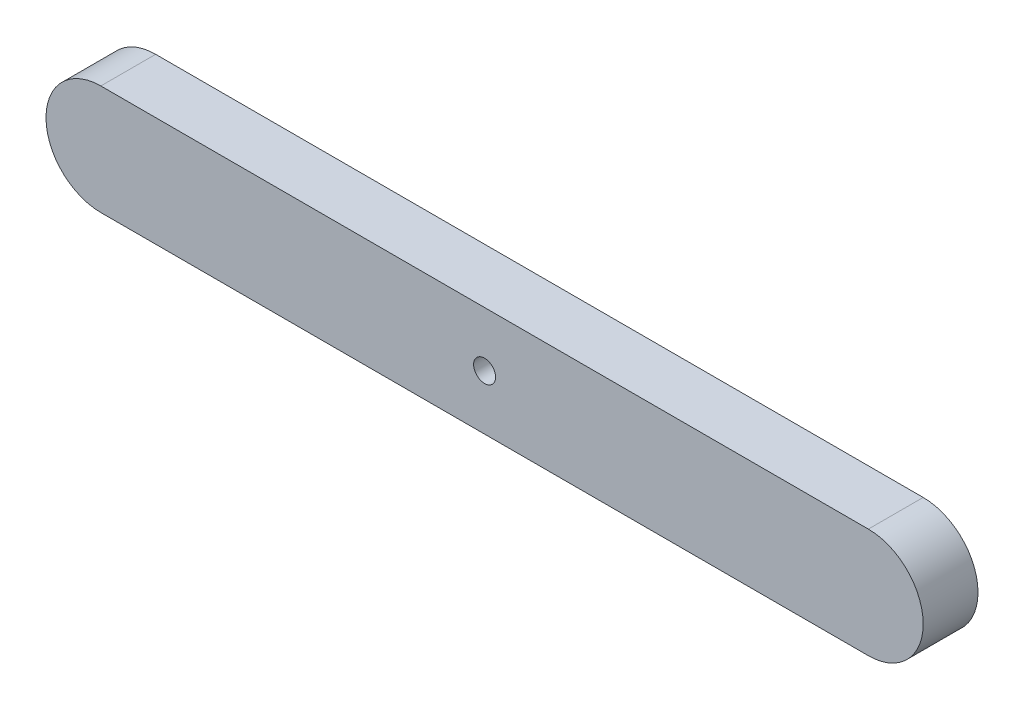
ISO-10303-21;
HEADER;
FILE_DESCRIPTION(('STEP AP214'),'2;1');
FILE_NAME('part.step','',(''),(''),'','','');
FILE_SCHEMA(('AUTOMOTIVE_DESIGN { 1 0 10303 214 1 1 1 1 }'));
ENDSEC;
DATA;
#1=APPLICATION_CONTEXT('core data for automotive mechanical design processes');
#2=APPLICATION_PROTOCOL_DEFINITION('international standard','automotive_design',2000,#1);
#3=PRODUCT_CONTEXT('',#1,'mechanical');
#4=PRODUCT('Part','Part','',(#3));
#5=PRODUCT_RELATED_PRODUCT_CATEGORY('part','',(#4));
#6=PRODUCT_DEFINITION_FORMATION('','',#4);
#7=PRODUCT_DEFINITION_CONTEXT('part definition',#1,'design');
#8=PRODUCT_DEFINITION('design','',#6,#7);
#9=PRODUCT_DEFINITION_SHAPE('','',#8);
#10=(LENGTH_UNIT() NAMED_UNIT(*) SI_UNIT(.MILLI.,.METRE.));
#11=(NAMED_UNIT(*) PLANE_ANGLE_UNIT() SI_UNIT($,.RADIAN.));
#12=(NAMED_UNIT(*) SI_UNIT($,.STERADIAN.) SOLID_ANGLE_UNIT());
#13=UNCERTAINTY_MEASURE_WITH_UNIT(LENGTH_MEASURE(1.E-05),#10,'distance_accuracy_value','');
#14=(GEOMETRIC_REPRESENTATION_CONTEXT(3) GLOBAL_UNCERTAINTY_ASSIGNED_CONTEXT((#13)) GLOBAL_UNIT_ASSIGNED_CONTEXT((#10,
#11,#12)) REPRESENTATION_CONTEXT('',''));
#15=CARTESIAN_POINT('',(0.,0.,0.));
#16=DIRECTION('',(0.,0.,1.));
#17=DIRECTION('',(1.,0.,0.));
#18=AXIS2_PLACEMENT_3D('',#15,#16,#17);
#19=CARTESIAN_POINT('',(35.,0.,5.));
#20=DIRECTION('',(0.,0.,-1.));
#21=DIRECTION('',(-1.,0.,0.));
#22=AXIS2_PLACEMENT_3D('',#19,#20,#21);
#23=CYLINDRICAL_SURFACE('',#22,5.);
#24=CARTESIAN_POINT('',(35.,0.,0.));
#25=DIRECTION('',(0.,0.,1.));
#26=DIRECTION('',(1.,0.,0.));
#27=AXIS2_PLACEMENT_3D('',#24,#25,#26);
#28=CIRCLE('',#27,5.);
#29=CARTESIAN_POINT('',(35.,-5.,0.));
#30=VERTEX_POINT('',#29);
#31=CARTESIAN_POINT('',(35.,5.,0.));
#32=VERTEX_POINT('',#31);
#33=EDGE_CURVE('E102',#30,#32,#28,.T.);
#34=ORIENTED_EDGE('',*,*,#33,.T.);
#35=DIRECTION('',(0.,0.,-1.));
#36=VECTOR('',#35,1.);
#37=CARTESIAN_POINT('',(35.,5.,5.));
#38=LINE('',#37,#36);
#39=CARTESIAN_POINT('',(35.,5.,5.));
#40=VERTEX_POINT('',#39);
#41=EDGE_CURVE('E11',#40,#32,#38,.T.);
#42=ORIENTED_EDGE('',*,*,#41,.F.);
#43=CARTESIAN_POINT('',(35.,0.,5.));
#44=DIRECTION('',(0.,0.,1.));
#45=DIRECTION('',(1.,0.,0.));
#46=AXIS2_PLACEMENT_3D('',#43,#44,#45);
#47=CIRCLE('',#46,5.);
#48=CARTESIAN_POINT('',(35.,-5.,5.));
#49=VERTEX_POINT('',#48);
#50=EDGE_CURVE('E90',#49,#40,#47,.T.);
#51=ORIENTED_EDGE('',*,*,#50,.F.);
#52=DIRECTION('',(0.,0.,-1.));
#53=VECTOR('',#52,1.);
#54=CARTESIAN_POINT('',(35.,-5.,5.));
#55=LINE('',#54,#53);
#56=EDGE_CURVE('E98',#49,#30,#55,.T.);
#57=ORIENTED_EDGE('',*,*,#56,.T.);
#58=EDGE_LOOP('',(#34,#42,#51,#57));
#59=FACE_BOUND('',#58,.T.);
#60=ADVANCED_FACE('F39',(#59),#23,.T.);
#61=CARTESIAN_POINT('',(-35.,5.,5.));
#62=DIRECTION('',(0.,-1.,0.));
#63=DIRECTION('',(0.,0.,-1.));
#64=AXIS2_PLACEMENT_3D('',#61,#62,#63);
#65=PLANE('',#64);
#66=DIRECTION('',(-1.,0.,0.));
#67=VECTOR('',#66,1.);
#68=CARTESIAN_POINT('',(-35.,5.,0.));
#69=LINE('',#68,#67);
#70=CARTESIAN_POINT('',(-35.,5.,0.));
#71=VERTEX_POINT('',#70);
#72=EDGE_CURVE('E94',#32,#71,#69,.T.);
#73=ORIENTED_EDGE('',*,*,#72,.T.);
#74=DIRECTION('',(0.,0.,-1.));
#75=VECTOR('',#74,1.);
#76=CARTESIAN_POINT('',(-35.,5.,5.));
#77=LINE('',#76,#75);
#78=CARTESIAN_POINT('',(-35.,5.,5.));
#79=VERTEX_POINT('',#78);
#80=EDGE_CURVE('E47',#79,#71,#77,.T.);
#81=ORIENTED_EDGE('',*,*,#80,.F.);
#82=DIRECTION('',(-1.,0.,0.));
#83=VECTOR('',#82,1.);
#84=CARTESIAN_POINT('',(-35.,5.,5.));
#85=LINE('',#84,#83);
#86=EDGE_CURVE('E85',#40,#79,#85,.T.);
#87=ORIENTED_EDGE('',*,*,#86,.F.);
#88=ORIENTED_EDGE('',*,*,#41,.T.);
#89=EDGE_LOOP('',(#73,#81,#87,#88));
#90=FACE_BOUND('',#89,.T.);
#91=ADVANCED_FACE('F93',(#90),#65,.F.);
#92=CARTESIAN_POINT('',(-35.,0.,5.));
#93=DIRECTION('',(0.,0.,-1.));
#94=DIRECTION('',(-1.,0.,0.));
#95=AXIS2_PLACEMENT_3D('',#92,#93,#94);
#96=CYLINDRICAL_SURFACE('',#95,5.);
#97=CARTESIAN_POINT('',(-35.,0.,0.));
#98=DIRECTION('',(0.,0.,1.));
#99=DIRECTION('',(1.,0.,0.));
#100=AXIS2_PLACEMENT_3D('',#97,#98,#99);
#101=CIRCLE('',#100,5.);
#102=CARTESIAN_POINT('',(-35.,-5.,0.));
#103=VERTEX_POINT('',#102);
#104=EDGE_CURVE('E72',#71,#103,#101,.T.);
#105=ORIENTED_EDGE('',*,*,#104,.T.);
#106=DIRECTION('',(0.,0.,-1.));
#107=VECTOR('',#106,1.);
#108=CARTESIAN_POINT('',(-35.,-5.,5.));
#109=LINE('',#108,#107);
#110=CARTESIAN_POINT('',(-35.,-5.,5.));
#111=VERTEX_POINT('',#110);
#112=EDGE_CURVE('E95',#111,#103,#109,.T.);
#113=ORIENTED_EDGE('',*,*,#112,.F.);
#114=CARTESIAN_POINT('',(-35.,0.,5.));
#115=DIRECTION('',(0.,0.,1.));
#116=DIRECTION('',(1.,0.,0.));
#117=AXIS2_PLACEMENT_3D('',#114,#115,#116);
#118=CIRCLE('',#117,5.);
#119=EDGE_CURVE('E88',#79,#111,#118,.T.);
#120=ORIENTED_EDGE('',*,*,#119,.F.);
#121=ORIENTED_EDGE('',*,*,#80,.T.);
#122=EDGE_LOOP('',(#105,#113,#120,#121));
#123=FACE_BOUND('',#122,.T.);
#124=ADVANCED_FACE('F96',(#123),#96,.T.);
#125=CARTESIAN_POINT('',(-35.,-5.,5.));
#126=DIRECTION('',(0.,1.,0.));
#127=DIRECTION('',(0.,0.,1.));
#128=AXIS2_PLACEMENT_3D('',#125,#126,#127);
#129=PLANE('',#128);
#130=DIRECTION('',(1.,0.,0.));
#131=VECTOR('',#130,1.);
#132=CARTESIAN_POINT('',(-35.,-5.,0.));
#133=LINE('',#132,#131);
#134=EDGE_CURVE('E78',#103,#30,#133,.T.);
#135=ORIENTED_EDGE('',*,*,#134,.T.);
#136=ORIENTED_EDGE('',*,*,#56,.F.);
#137=DIRECTION('',(1.,0.,0.));
#138=VECTOR('',#137,1.);
#139=CARTESIAN_POINT('',(-35.,-5.,5.));
#140=LINE('',#139,#138);
#141=EDGE_CURVE('E55',#111,#49,#140,.T.);
#142=ORIENTED_EDGE('',*,*,#141,.F.);
#143=ORIENTED_EDGE('',*,*,#112,.T.);
#144=EDGE_LOOP('',(#135,#136,#142,#143));
#145=FACE_BOUND('',#144,.T.);
#146=ADVANCED_FACE('F110',(#145),#129,.F.);
#147=CARTESIAN_POINT('',(35.,0.,5.));
#148=DIRECTION('',(0.,0.,1.));
#149=DIRECTION('',(1.,0.,0.));
#150=AXIS2_PLACEMENT_3D('',#147,#148,#149);
#151=PLANE('',#150);
#152=CARTESIAN_POINT('',(0.,0.,5.));
#153=DIRECTION('',(0.,0.,1.));
#154=DIRECTION('',(1.,0.,0.));
#155=AXIS2_PLACEMENT_3D('',#152,#153,#154);
#156=CIRCLE('',#155,1.);
#157=CARTESIAN_POINT('',(1.,0.,5.));
#158=VERTEX_POINT('',#157);
#159=EDGE_CURVE('E105',#158,#158,#156,.T.);
#160=ORIENTED_EDGE('',*,*,#159,.F.);
#161=EDGE_LOOP('',(#160));
#162=FACE_BOUND('',#161,.T.);
#163=ORIENTED_EDGE('',*,*,#50,.T.);
#164=ORIENTED_EDGE('',*,*,#86,.T.);
#165=ORIENTED_EDGE('',*,*,#119,.T.);
#166=ORIENTED_EDGE('',*,*,#141,.T.);
#167=EDGE_LOOP('',(#163,#164,#165,#166));
#168=FACE_BOUND('',#167,.T.);
#169=ADVANCED_FACE('F86',(#162,#168),#151,.T.);
#170=CARTESIAN_POINT('',(35.,0.,0.));
#171=DIRECTION('',(0.,0.,1.));
#172=DIRECTION('',(1.,0.,0.));
#173=AXIS2_PLACEMENT_3D('',#170,#171,#172);
#174=PLANE('',#173);
#175=CARTESIAN_POINT('',(0.,0.,0.));
#176=DIRECTION('',(0.,0.,-1.));
#177=DIRECTION('',(-1.,0.,0.));
#178=AXIS2_PLACEMENT_3D('',#175,#176,#177);
#179=CIRCLE('',#178,1.);
#180=CARTESIAN_POINT('',(-1.,0.,0.));
#181=VERTEX_POINT('',#180);
#182=EDGE_CURVE('E118',#181,#181,#179,.T.);
#183=ORIENTED_EDGE('',*,*,#182,.F.);
#184=EDGE_LOOP('',(#183));
#185=FACE_BOUND('',#184,.T.);
#186=ORIENTED_EDGE('',*,*,#33,.F.);
#187=ORIENTED_EDGE('',*,*,#134,.F.);
#188=ORIENTED_EDGE('',*,*,#104,.F.);
#189=ORIENTED_EDGE('',*,*,#72,.F.);
#190=EDGE_LOOP('',(#186,#187,#188,#189));
#191=FACE_BOUND('',#190,.T.);
#192=ADVANCED_FACE('F113',(#185,#191),#174,.F.);
#193=CARTESIAN_POINT('',(0.,0.,10.));
#194=DIRECTION('',(0.,0.,-1.));
#195=DIRECTION('',(-1.,0.,0.));
#196=AXIS2_PLACEMENT_3D('',#193,#194,#195);
#197=CYLINDRICAL_SURFACE('',#196,1.);
#198=ORIENTED_EDGE('',*,*,#159,.T.);
#199=EDGE_LOOP('',(#198));
#200=FACE_BOUND('',#199,.T.);
#201=ORIENTED_EDGE('',*,*,#182,.T.);
#202=EDGE_LOOP('',(#201));
#203=FACE_BOUND('',#202,.T.);
#204=ADVANCED_FACE('F122',(#200,#203),#197,.F.);
#205=CLOSED_SHELL('',(#60,#91,#124,#146,#169,#192,#204));
#206=MANIFOLD_SOLID_BREP('B2',#205);
#207=ADVANCED_BREP_SHAPE_REPRESENTATION('',(#18,#206),#14);
#208=SHAPE_DEFINITION_REPRESENTATION(#9,#207);
ENDSEC;
END-ISO-10303-21;
